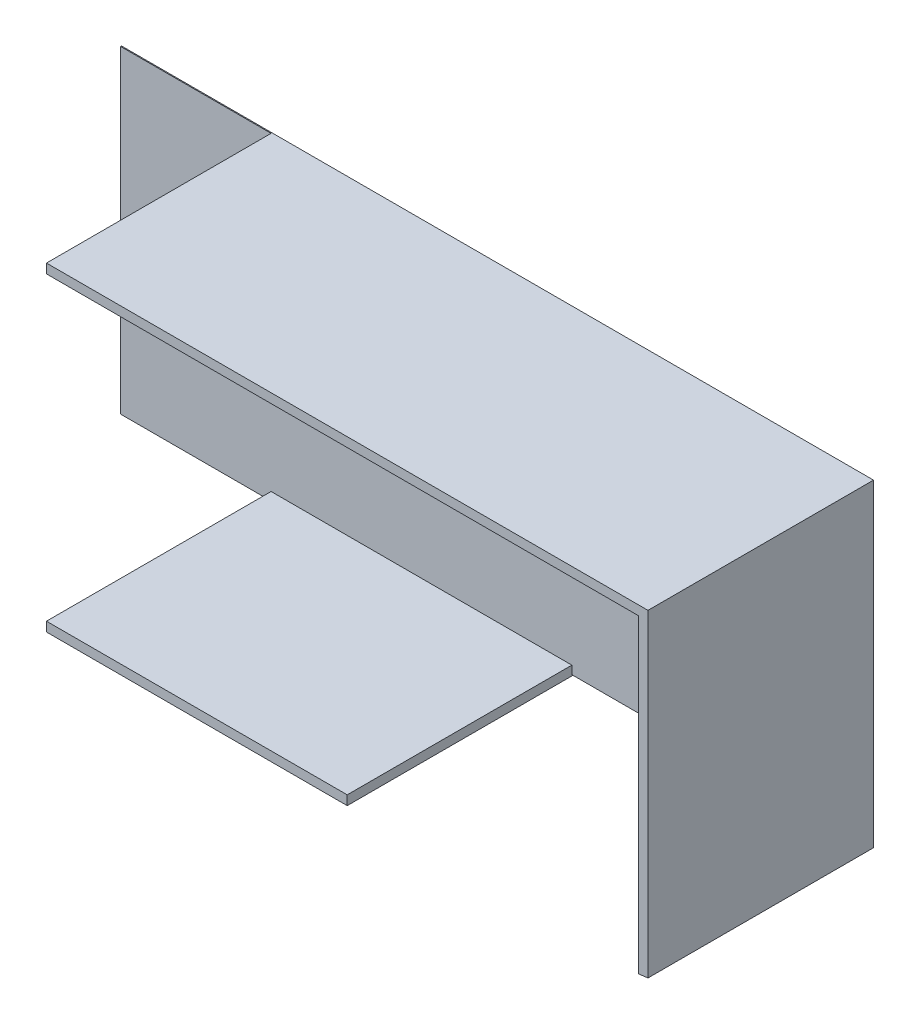
ISO-10303-21;
HEADER;
FILE_DESCRIPTION(('STEP AP214'),'2;1');
FILE_NAME('part.step','',(''),(''),'','','');
FILE_SCHEMA(('AUTOMOTIVE_DESIGN { 1 0 10303 214 1 1 1 1 }'));
ENDSEC;
DATA;
#1=APPLICATION_CONTEXT('core data for automotive mechanical design processes');
#2=APPLICATION_PROTOCOL_DEFINITION('international standard','automotive_design',2000,#1);
#3=PRODUCT_CONTEXT('',#1,'mechanical');
#4=PRODUCT('Part','Part','',(#3));
#5=PRODUCT_RELATED_PRODUCT_CATEGORY('part','',(#4));
#6=PRODUCT_DEFINITION_FORMATION('','',#4);
#7=PRODUCT_DEFINITION_CONTEXT('part definition',#1,'design');
#8=PRODUCT_DEFINITION('design','',#6,#7);
#9=PRODUCT_DEFINITION_SHAPE('','',#8);
#10=(LENGTH_UNIT() NAMED_UNIT(*) SI_UNIT(.MILLI.,.METRE.));
#11=(NAMED_UNIT(*) PLANE_ANGLE_UNIT() SI_UNIT($,.RADIAN.));
#12=(NAMED_UNIT(*) SI_UNIT($,.STERADIAN.) SOLID_ANGLE_UNIT());
#13=UNCERTAINTY_MEASURE_WITH_UNIT(LENGTH_MEASURE(1.E-05),#10,'distance_accuracy_value','');
#14=(GEOMETRIC_REPRESENTATION_CONTEXT(3) GLOBAL_UNCERTAINTY_ASSIGNED_CONTEXT((#13)) GLOBAL_UNIT_ASSIGNED_CONTEXT((#10,
#11,#12)) REPRESENTATION_CONTEXT('',''));
#15=CARTESIAN_POINT('',(0.,0.,0.));
#16=DIRECTION('',(0.,0.,1.));
#17=DIRECTION('',(1.,0.,0.));
#18=AXIS2_PLACEMENT_3D('',#15,#16,#17);
#19=CARTESIAN_POINT('',(406.4,-208.782857964852,0.635));
#20=DIRECTION('',(0.,-1.,0.));
#21=DIRECTION('',(0.,0.,-1.));
#22=AXIS2_PLACEMENT_3D('',#19,#20,#21);
#23=PLANE('',#22);
#24=DIRECTION('',(-1.,0.,0.));
#25=VECTOR('',#24,1.);
#26=CARTESIAN_POINT('',(406.4,-208.782857964852,0.635));
#27=LINE('',#26,#25);
#28=CARTESIAN_POINT('',(400.096509451272,-208.782857964852,0.634999999999997));
#29=VERTEX_POINT('',#28);
#30=CARTESIAN_POINT('',(203.2,-208.782857964852,0.635));
#31=VERTEX_POINT('',#30);
#32=EDGE_CURVE('E218',#29,#31,#27,.T.);
#33=ORIENTED_EDGE('',*,*,#32,.T.);
#34=DIRECTION('',(0.,0.,-1.));
#35=VECTOR('',#34,1.);
#36=CARTESIAN_POINT('',(203.2,-208.782857964852,0.635));
#37=LINE('',#36,#35);
#38=CARTESIAN_POINT('',(203.2,-208.782857964852,0.));
#39=VERTEX_POINT('',#38);
#40=EDGE_CURVE('E209',#31,#39,#37,.T.);
#41=ORIENTED_EDGE('',*,*,#40,.T.);
#42=DIRECTION('',(-1.,0.,0.));
#43=VECTOR('',#42,1.);
#44=CARTESIAN_POINT('',(406.4,-208.782857964852,0.));
#45=LINE('',#44,#43);
#46=CARTESIAN_POINT('',(400.096509451272,-208.782857964852,0.));
#47=VERTEX_POINT('',#46);
#48=EDGE_CURVE('E232',#47,#39,#45,.T.);
#49=ORIENTED_EDGE('',*,*,#48,.F.);
#50=DIRECTION('',(0.,0.,-1.));
#51=VECTOR('',#50,1.);
#52=CARTESIAN_POINT('',(400.096509451272,-208.782857964852,152.4));
#53=LINE('',#52,#51);
#54=EDGE_CURVE('E244',#29,#47,#53,.T.);
#55=ORIENTED_EDGE('',*,*,#54,.F.);
#56=EDGE_LOOP('',(#33,#41,#49,#55));
#57=FACE_BOUND('',#56,.T.);
#58=ADVANCED_FACE('F71',(#57),#23,.T.);
#59=CARTESIAN_POINT('',(0.,0.,0.635));
#60=DIRECTION('',(0.,0.,-1.));
#61=DIRECTION('',(-1.,0.,0.));
#62=AXIS2_PLACEMENT_3D('',#59,#60,#61);
#63=PLANE('',#62);
#64=DIRECTION('',(0.,1.,0.));
#65=VECTOR('',#64,1.);
#66=CARTESIAN_POINT('',(203.2,0.,0.635));
#67=LINE('',#66,#65);
#68=CARTESIAN_POINT('',(203.2,-203.2,0.635000000000052));
#69=VERTEX_POINT('',#68);
#70=EDGE_CURVE('E12',#31,#69,#67,.T.);
#71=ORIENTED_EDGE('',*,*,#70,.F.);
#72=ORIENTED_EDGE('',*,*,#32,.F.);
#73=DIRECTION('',(0.,1.,0.));
#74=VECTOR('',#73,1.);
#75=CARTESIAN_POINT('',(400.096509451272,0.,0.634999999999997));
#76=LINE('',#75,#74);
#77=CARTESIAN_POINT('',(400.096509451272,0.,0.635000000000052));
#78=VERTEX_POINT('',#77);
#79=EDGE_CURVE('E313',#29,#78,#76,.T.);
#80=ORIENTED_EDGE('',*,*,#79,.T.);
#81=DIRECTION('',(-1.,0.,0.));
#82=VECTOR('',#81,1.);
#83=CARTESIAN_POINT('',(0.,0.,0.634999999999997));
#84=LINE('',#83,#82);
#85=CARTESIAN_POINT('',(0.,0.,0.635000000000052));
#86=VERTEX_POINT('',#85);
#87=EDGE_CURVE('E251',#78,#86,#84,.T.);
#88=ORIENTED_EDGE('',*,*,#87,.T.);
#89=DIRECTION('',(0.,-1.,0.));
#90=VECTOR('',#89,1.);
#91=CARTESIAN_POINT('',(0.,0.,0.634999999999997));
#92=LINE('',#91,#90);
#93=CARTESIAN_POINT('',(0.,6.35,0.635000000000052));
#94=VERTEX_POINT('',#93);
#95=EDGE_CURVE('E255',#94,#86,#92,.T.);
#96=ORIENTED_EDGE('',*,*,#95,.F.);
#97=DIRECTION('',(1.,0.,0.));
#98=VECTOR('',#97,1.);
#99=CARTESIAN_POINT('',(-101.6,6.35,0.635));
#100=LINE('',#99,#98);
#101=CARTESIAN_POINT('',(-101.6,6.35,0.635));
#102=VERTEX_POINT('',#101);
#103=EDGE_CURVE('E227',#102,#94,#100,.T.);
#104=ORIENTED_EDGE('',*,*,#103,.F.);
#105=DIRECTION('',(0.,1.,0.));
#106=VECTOR('',#105,1.);
#107=CARTESIAN_POINT('',(-101.6,-208.782857964852,0.635));
#108=LINE('',#107,#106);
#109=CARTESIAN_POINT('',(-101.6,-208.782857964852,0.635));
#110=VERTEX_POINT('',#109);
#111=EDGE_CURVE('E222',#110,#102,#108,.T.);
#112=ORIENTED_EDGE('',*,*,#111,.F.);
#113=CARTESIAN_POINT('',(0.,-208.782857964852,0.635));
#114=VERTEX_POINT('',#113);
#115=EDGE_CURVE('E223',#114,#110,#27,.T.);
#116=ORIENTED_EDGE('',*,*,#115,.F.);
#117=DIRECTION('',(0.,1.,0.));
#118=VECTOR('',#117,1.);
#119=CARTESIAN_POINT('',(0.,0.,0.635));
#120=LINE('',#119,#118);
#121=CARTESIAN_POINT('',(0.,-203.2,0.635));
#122=VERTEX_POINT('',#121);
#123=EDGE_CURVE('E317',#114,#122,#120,.T.);
#124=ORIENTED_EDGE('',*,*,#123,.T.);
#125=DIRECTION('',(1.,0.,0.));
#126=VECTOR('',#125,1.);
#127=CARTESIAN_POINT('',(0.,-203.2,0.635));
#128=LINE('',#127,#126);
#129=EDGE_CURVE('E80',#122,#69,#128,.T.);
#130=ORIENTED_EDGE('',*,*,#129,.T.);
#131=EDGE_LOOP('',(#71,#72,#80,#88,#96,#104,#112,#116,#124,#130));
#132=FACE_BOUND('',#131,.T.);
#133=ADVANCED_FACE('F324',(#132),#63,.F.);
#134=CARTESIAN_POINT('',(0.,0.,152.4));
#135=DIRECTION('',(-1.,0.,0.));
#136=DIRECTION('',(0.,0.,1.));
#137=AXIS2_PLACEMENT_3D('',#134,#135,#136);
#138=PLANE('',#137);
#139=DIRECTION('',(0.,0.,-1.));
#140=VECTOR('',#139,1.);
#141=CARTESIAN_POINT('',(0.,6.35,152.4));
#142=LINE('',#141,#140);
#143=CARTESIAN_POINT('',(0.,6.35,152.4));
#144=VERTEX_POINT('',#143);
#145=EDGE_CURVE('E95',#144,#94,#142,.T.);
#146=ORIENTED_EDGE('',*,*,#145,.T.);
#147=ORIENTED_EDGE('',*,*,#95,.T.);
#148=DIRECTION('',(0.,0.,-1.));
#149=VECTOR('',#148,1.);
#150=CARTESIAN_POINT('',(0.,0.,152.4));
#151=LINE('',#150,#149);
#152=CARTESIAN_POINT('',(0.,0.,152.4));
#153=VERTEX_POINT('',#152);
#154=EDGE_CURVE('E301',#153,#86,#151,.T.);
#155=ORIENTED_EDGE('',*,*,#154,.F.);
#156=DIRECTION('',(0.,1.,0.));
#157=VECTOR('',#156,1.);
#158=CARTESIAN_POINT('',(0.,0.,152.4));
#159=LINE('',#158,#157);
#160=EDGE_CURVE('E271',#153,#144,#159,.T.);
#161=ORIENTED_EDGE('',*,*,#160,.T.);
#162=EDGE_LOOP('',(#146,#147,#155,#161));
#163=FACE_BOUND('',#162,.T.);
#164=ADVANCED_FACE('F382',(#163),#138,.T.);
#165=CARTESIAN_POINT('',(0.,0.,152.4));
#166=DIRECTION('',(0.,1.,0.));
#167=DIRECTION('',(0.,0.,1.));
#168=AXIS2_PLACEMENT_3D('',#165,#166,#167);
#169=PLANE('',#168);
#170=ORIENTED_EDGE('',*,*,#87,.F.);
#171=DIRECTION('',(0.,0.,-1.));
#172=VECTOR('',#171,1.);
#173=CARTESIAN_POINT('',(400.096509451272,0.,152.4));
#174=LINE('',#173,#172);
#175=CARTESIAN_POINT('',(400.096509451272,0.,152.4));
#176=VERTEX_POINT('',#175);
#177=EDGE_CURVE('E297',#176,#78,#174,.T.);
#178=ORIENTED_EDGE('',*,*,#177,.F.);
#179=DIRECTION('',(1.,0.,0.));
#180=VECTOR('',#179,1.);
#181=CARTESIAN_POINT('',(0.,0.,152.4));
#182=LINE('',#181,#180);
#183=EDGE_CURVE('E274',#153,#176,#182,.T.);
#184=ORIENTED_EDGE('',*,*,#183,.F.);
#185=ORIENTED_EDGE('',*,*,#154,.T.);
#186=EDGE_LOOP('',(#170,#178,#184,#185));
#187=FACE_BOUND('',#186,.T.);
#188=ADVANCED_FACE('F380',(#187),#169,.F.);
#189=CARTESIAN_POINT('',(30.9696755894847,-254.473159377706,152.4));
#190=DIRECTION('',(-0.120809769314614,0.992675676965115,0.));
#191=DIRECTION('',(-0.992675676965115,-0.120809769314614,0.));
#192=AXIS2_PLACEMENT_3D('',#189,#190,#191);
#193=PLANE('',#192);
#194=DIRECTION('',(0.992675676965115,0.120809769314614,0.));
#195=VECTOR('',#194,1.);
#196=CARTESIAN_POINT('',(30.9696755894847,-254.473159377706,0.));
#197=LINE('',#196,#195);
#198=CARTESIAN_POINT('',(400.096509451272,-209.55,0.));
#199=VERTEX_POINT('',#198);
#200=CARTESIAN_POINT('',(406.4,-208.782857964852,0.));
#201=VERTEX_POINT('',#200);
#202=EDGE_CURVE('E258',#199,#201,#197,.T.);
#203=ORIENTED_EDGE('',*,*,#202,.T.);
#204=DIRECTION('',(0.,0.,-1.));
#205=VECTOR('',#204,1.);
#206=CARTESIAN_POINT('',(406.4,-208.782857964852,152.4));
#207=LINE('',#206,#205);
#208=CARTESIAN_POINT('',(406.4,-208.782857964852,152.4));
#209=VERTEX_POINT('',#208);
#210=EDGE_CURVE('E310',#209,#201,#207,.T.);
#211=ORIENTED_EDGE('',*,*,#210,.F.);
#212=DIRECTION('',(0.992675676965115,0.120809769314614,0.));
#213=VECTOR('',#212,1.);
#214=CARTESIAN_POINT('',(30.9696755894847,-254.473159377706,152.4));
#215=LINE('',#214,#213);
#216=CARTESIAN_POINT('',(400.096509451272,-209.55,152.4));
#217=VERTEX_POINT('',#216);
#218=EDGE_CURVE('E259',#217,#209,#215,.T.);
#219=ORIENTED_EDGE('',*,*,#218,.F.);
#220=DIRECTION('',(0.,0.,-1.));
#221=VECTOR('',#220,1.);
#222=CARTESIAN_POINT('',(400.096509451272,-209.55,152.4));
#223=LINE('',#222,#221);
#224=EDGE_CURVE('E280',#217,#199,#223,.T.);
#225=ORIENTED_EDGE('',*,*,#224,.T.);
#226=EDGE_LOOP('',(#203,#211,#219,#225));
#227=FACE_BOUND('',#226,.T.);
#228=ADVANCED_FACE('F73',(#227),#193,.F.);
#229=CARTESIAN_POINT('',(406.4,0.,152.4));
#230=DIRECTION('',(-1.,0.,0.));
#231=DIRECTION('',(0.,0.,1.));
#232=AXIS2_PLACEMENT_3D('',#229,#230,#231);
#233=PLANE('',#232);
#234=DIRECTION('',(0.,1.,0.));
#235=VECTOR('',#234,1.);
#236=CARTESIAN_POINT('',(406.4,0.,0.));
#237=LINE('',#236,#235);
#238=CARTESIAN_POINT('',(406.4,6.35,0.));
#239=VERTEX_POINT('',#238);
#240=EDGE_CURVE('E284',#201,#239,#237,.T.);
#241=ORIENTED_EDGE('',*,*,#240,.T.);
#242=DIRECTION('',(0.,0.,-1.));
#243=VECTOR('',#242,1.);
#244=CARTESIAN_POINT('',(406.4,6.35,152.4));
#245=LINE('',#244,#243);
#246=CARTESIAN_POINT('',(406.4,6.35,152.4));
#247=VERTEX_POINT('',#246);
#248=EDGE_CURVE('E307',#247,#239,#245,.T.);
#249=ORIENTED_EDGE('',*,*,#248,.F.);
#250=DIRECTION('',(0.,1.,0.));
#251=VECTOR('',#250,1.);
#252=CARTESIAN_POINT('',(406.4,0.,152.4));
#253=LINE('',#252,#251);
#254=EDGE_CURVE('E263',#209,#247,#253,.T.);
#255=ORIENTED_EDGE('',*,*,#254,.F.);
#256=ORIENTED_EDGE('',*,*,#210,.T.);
#257=EDGE_LOOP('',(#241,#249,#255,#256));
#258=FACE_BOUND('',#257,.T.);
#259=ADVANCED_FACE('F386',(#258),#233,.F.);
#260=CARTESIAN_POINT('',(0.,6.35,152.4));
#261=DIRECTION('',(0.,1.,0.));
#262=DIRECTION('',(0.,0.,1.));
#263=AXIS2_PLACEMENT_3D('',#260,#261,#262);
#264=PLANE('',#263);
#265=ORIENTED_EDGE('',*,*,#103,.T.);
#266=ORIENTED_EDGE('',*,*,#145,.F.);
#267=DIRECTION('',(1.,0.,0.));
#268=VECTOR('',#267,1.);
#269=CARTESIAN_POINT('',(0.,6.35,152.4));
#270=LINE('',#269,#268);
#271=EDGE_CURVE('E267',#144,#247,#270,.T.);
#272=ORIENTED_EDGE('',*,*,#271,.T.);
#273=ORIENTED_EDGE('',*,*,#248,.T.);
#274=DIRECTION('',(1.,0.,0.));
#275=VECTOR('',#274,1.);
#276=CARTESIAN_POINT('',(0.,6.35,0.));
#277=LINE('',#276,#275);
#278=CARTESIAN_POINT('',(-101.6,6.35,0.));
#279=VERTEX_POINT('',#278);
#280=EDGE_CURVE('E288',#279,#239,#277,.T.);
#281=ORIENTED_EDGE('',*,*,#280,.F.);
#282=DIRECTION('',(0.,0.,-1.));
#283=VECTOR('',#282,1.);
#284=CARTESIAN_POINT('',(-101.6,6.35,0.635));
#285=LINE('',#284,#283);
#286=EDGE_CURVE('E240',#102,#279,#285,.T.);
#287=ORIENTED_EDGE('',*,*,#286,.F.);
#288=EDGE_LOOP('',(#265,#266,#272,#273,#281,#287));
#289=FACE_BOUND('',#288,.T.);
#290=ADVANCED_FACE('F362',(#289),#264,.T.);
#291=CARTESIAN_POINT('',(400.096509451272,0.,152.4));
#292=DIRECTION('',(1.,0.,0.));
#293=DIRECTION('',(0.,0.,-1.));
#294=AXIS2_PLACEMENT_3D('',#291,#292,#293);
#295=PLANE('',#294);
#296=ORIENTED_EDGE('',*,*,#79,.F.);
#297=ORIENTED_EDGE('',*,*,#54,.T.);
#298=DIRECTION('',(0.,-1.,0.));
#299=VECTOR('',#298,1.);
#300=CARTESIAN_POINT('',(400.096509451272,0.,0.));
#301=LINE('',#300,#299);
#302=EDGE_CURVE('E264',#47,#199,#301,.T.);
#303=ORIENTED_EDGE('',*,*,#302,.T.);
#304=ORIENTED_EDGE('',*,*,#224,.F.);
#305=DIRECTION('',(0.,-1.,0.));
#306=VECTOR('',#305,1.);
#307=CARTESIAN_POINT('',(400.096509451272,0.,152.4));
#308=LINE('',#307,#306);
#309=EDGE_CURVE('E277',#176,#217,#308,.T.);
#310=ORIENTED_EDGE('',*,*,#309,.F.);
#311=ORIENTED_EDGE('',*,*,#177,.T.);
#312=EDGE_LOOP('',(#296,#297,#303,#304,#310,#311));
#313=FACE_BOUND('',#312,.T.);
#314=ADVANCED_FACE('F373',(#313),#295,.F.);
#315=CARTESIAN_POINT('',(0.,0.,152.4));
#316=DIRECTION('',(0.,0.,1.));
#317=DIRECTION('',(1.,0.,0.));
#318=AXIS2_PLACEMENT_3D('',#315,#316,#317);
#319=PLANE('',#318);
#320=ORIENTED_EDGE('',*,*,#218,.T.);
#321=ORIENTED_EDGE('',*,*,#254,.T.);
#322=ORIENTED_EDGE('',*,*,#271,.F.);
#323=ORIENTED_EDGE('',*,*,#160,.F.);
#324=ORIENTED_EDGE('',*,*,#183,.T.);
#325=ORIENTED_EDGE('',*,*,#309,.T.);
#326=EDGE_LOOP('',(#320,#321,#322,#323,#324,#325));
#327=FACE_BOUND('',#326,.T.);
#328=ADVANCED_FACE('F385',(#327),#319,.T.);
#329=CARTESIAN_POINT('',(0.,0.,0.));
#330=DIRECTION('',(0.,0.,1.));
#331=DIRECTION('',(1.,0.,0.));
#332=AXIS2_PLACEMENT_3D('',#329,#330,#331);
#333=PLANE('',#332);
#334=ORIENTED_EDGE('',*,*,#48,.T.);
#335=DIRECTION('',(0.,1.,0.));
#336=VECTOR('',#335,1.);
#337=CARTESIAN_POINT('',(203.2,0.,0.));
#338=LINE('',#337,#336);
#339=CARTESIAN_POINT('',(203.2,-209.55,0.));
#340=VERTEX_POINT('',#339);
#341=EDGE_CURVE('E337',#340,#39,#338,.T.);
#342=ORIENTED_EDGE('',*,*,#341,.F.);
#343=DIRECTION('',(1.,0.,0.));
#344=VECTOR('',#343,1.);
#345=CARTESIAN_POINT('',(0.,-209.55,0.));
#346=LINE('',#345,#344);
#347=CARTESIAN_POINT('',(0.,-209.55,0.));
#348=VERTEX_POINT('',#347);
#349=EDGE_CURVE('E203',#348,#340,#346,.T.);
#350=ORIENTED_EDGE('',*,*,#349,.F.);
#351=DIRECTION('',(0.,1.,0.));
#352=VECTOR('',#351,1.);
#353=CARTESIAN_POINT('',(0.,0.,0.));
#354=LINE('',#353,#352);
#355=CARTESIAN_POINT('',(0.,-208.782857964852,0.));
#356=VERTEX_POINT('',#355);
#357=EDGE_CURVE('E199',#348,#356,#354,.T.);
#358=ORIENTED_EDGE('',*,*,#357,.T.);
#359=CARTESIAN_POINT('',(-101.6,-208.782857964852,0.));
#360=VERTEX_POINT('',#359);
#361=EDGE_CURVE('E217',#356,#360,#45,.T.);
#362=ORIENTED_EDGE('',*,*,#361,.T.);
#363=DIRECTION('',(0.,1.,0.));
#364=VECTOR('',#363,1.);
#365=CARTESIAN_POINT('',(-101.6,-208.782857964852,0.));
#366=LINE('',#365,#364);
#367=EDGE_CURVE('E236',#360,#279,#366,.T.);
#368=ORIENTED_EDGE('',*,*,#367,.T.);
#369=ORIENTED_EDGE('',*,*,#280,.T.);
#370=ORIENTED_EDGE('',*,*,#240,.F.);
#371=ORIENTED_EDGE('',*,*,#202,.F.);
#372=ORIENTED_EDGE('',*,*,#302,.F.);
#373=EDGE_LOOP('',(#334,#342,#350,#358,#362,#368,#369,#370,#371,#372));
#374=FACE_BOUND('',#373,.T.);
#375=ADVANCED_FACE('F347',(#374),#333,.F.);
#376=DIRECTION('',(0.,0.,-1.));
#377=VECTOR('',#376,1.);
#378=CARTESIAN_POINT('',(0.,-208.782857964852,0.635));
#379=LINE('',#378,#377);
#380=EDGE_CURVE('E205',#114,#356,#379,.T.);
#381=ORIENTED_EDGE('',*,*,#380,.F.);
#382=ORIENTED_EDGE('',*,*,#115,.T.);
#383=DIRECTION('',(0.,0.,-1.));
#384=VECTOR('',#383,1.);
#385=CARTESIAN_POINT('',(-101.6,-208.782857964852,0.635));
#386=LINE('',#385,#384);
#387=EDGE_CURVE('E231',#110,#360,#386,.T.);
#388=ORIENTED_EDGE('',*,*,#387,.T.);
#389=ORIENTED_EDGE('',*,*,#361,.F.);
#390=EDGE_LOOP('',(#381,#382,#388,#389));
#391=FACE_BOUND('',#390,.T.);
#392=ADVANCED_FACE('F352',(#391),#23,.T.);
#393=CARTESIAN_POINT('',(-101.6,-208.782857964852,0.635));
#394=DIRECTION('',(-1.,0.,0.));
#395=DIRECTION('',(0.,0.,1.));
#396=AXIS2_PLACEMENT_3D('',#393,#394,#395);
#397=PLANE('',#396);
#398=ORIENTED_EDGE('',*,*,#367,.F.);
#399=ORIENTED_EDGE('',*,*,#387,.F.);
#400=ORIENTED_EDGE('',*,*,#111,.T.);
#401=ORIENTED_EDGE('',*,*,#286,.T.);
#402=EDGE_LOOP('',(#398,#399,#400,#401));
#403=FACE_BOUND('',#402,.T.);
#404=ADVANCED_FACE('F360',(#403),#397,.T.);
#405=CARTESIAN_POINT('',(0.,-203.2,152.4));
#406=DIRECTION('',(0.,1.,0.));
#407=DIRECTION('',(0.,0.,1.));
#408=AXIS2_PLACEMENT_3D('',#405,#406,#407);
#409=PLANE('',#408);
#410=ORIENTED_EDGE('',*,*,#129,.F.);
#411=DIRECTION('',(0.,0.,-1.));
#412=VECTOR('',#411,1.);
#413=CARTESIAN_POINT('',(0.,-203.2,152.4));
#414=LINE('',#413,#412);
#415=CARTESIAN_POINT('',(0.,-203.2,152.4));
#416=VERTEX_POINT('',#415);
#417=EDGE_CURVE('E87',#416,#122,#414,.T.);
#418=ORIENTED_EDGE('',*,*,#417,.F.);
#419=DIRECTION('',(1.,0.,0.));
#420=VECTOR('',#419,1.);
#421=CARTESIAN_POINT('',(0.,-203.2,152.4));
#422=LINE('',#421,#420);
#423=CARTESIAN_POINT('',(203.2,-203.2,152.4));
#424=VERTEX_POINT('',#423);
#425=EDGE_CURVE('E190',#416,#424,#422,.T.);
#426=ORIENTED_EDGE('',*,*,#425,.T.);
#427=DIRECTION('',(0.,0.,-1.));
#428=VECTOR('',#427,1.);
#429=CARTESIAN_POINT('',(203.2,-203.2,152.4));
#430=LINE('',#429,#428);
#431=EDGE_CURVE('E185',#424,#69,#430,.T.);
#432=ORIENTED_EDGE('',*,*,#431,.T.);
#433=EDGE_LOOP('',(#410,#418,#426,#432));
#434=FACE_BOUND('',#433,.T.);
#435=ADVANCED_FACE('F328',(#434),#409,.T.);
#436=CARTESIAN_POINT('',(0.,-209.55,152.4));
#437=DIRECTION('',(0.,1.,0.));
#438=DIRECTION('',(-1.,0.,0.));
#439=AXIS2_PLACEMENT_3D('',#436,#437,#438);
#440=PLANE('',#439);
#441=ORIENTED_EDGE('',*,*,#349,.T.);
#442=DIRECTION('',(0.,0.,-1.));
#443=VECTOR('',#442,1.);
#444=CARTESIAN_POINT('',(203.2,-209.55,152.4));
#445=LINE('',#444,#443);
#446=CARTESIAN_POINT('',(203.2,-209.55,152.4));
#447=VERTEX_POINT('',#446);
#448=EDGE_CURVE('E182',#447,#340,#445,.T.);
#449=ORIENTED_EDGE('',*,*,#448,.F.);
#450=DIRECTION('',(1.,0.,0.));
#451=VECTOR('',#450,1.);
#452=CARTESIAN_POINT('',(0.,-209.55,152.4));
#453=LINE('',#452,#451);
#454=CARTESIAN_POINT('',(0.,-209.55,152.4));
#455=VERTEX_POINT('',#454);
#456=EDGE_CURVE('E191',#455,#447,#453,.T.);
#457=ORIENTED_EDGE('',*,*,#456,.F.);
#458=DIRECTION('',(0.,0.,-1.));
#459=VECTOR('',#458,1.);
#460=CARTESIAN_POINT('',(0.,-209.55,152.4));
#461=LINE('',#460,#459);
#462=EDGE_CURVE('E332',#455,#348,#461,.T.);
#463=ORIENTED_EDGE('',*,*,#462,.T.);
#464=EDGE_LOOP('',(#441,#449,#457,#463));
#465=FACE_BOUND('',#464,.T.);
#466=ADVANCED_FACE('F201',(#465),#440,.F.);
#467=CARTESIAN_POINT('',(203.2,0.,152.4));
#468=DIRECTION('',(-1.,0.,0.));
#469=DIRECTION('',(0.,0.,1.));
#470=AXIS2_PLACEMENT_3D('',#467,#468,#469);
#471=PLANE('',#470);
#472=ORIENTED_EDGE('',*,*,#40,.F.);
#473=ORIENTED_EDGE('',*,*,#70,.T.);
#474=ORIENTED_EDGE('',*,*,#431,.F.);
#475=DIRECTION('',(0.,1.,0.));
#476=VECTOR('',#475,1.);
#477=CARTESIAN_POINT('',(203.2,0.,152.4));
#478=LINE('',#477,#476);
#479=EDGE_CURVE('E178',#447,#424,#478,.T.);
#480=ORIENTED_EDGE('',*,*,#479,.F.);
#481=ORIENTED_EDGE('',*,*,#448,.T.);
#482=ORIENTED_EDGE('',*,*,#341,.T.);
#483=EDGE_LOOP('',(#472,#473,#474,#480,#481,#482));
#484=FACE_BOUND('',#483,.T.);
#485=ADVANCED_FACE('F180',(#484),#471,.F.);
#486=CARTESIAN_POINT('',(0.,0.,152.4));
#487=DIRECTION('',(-1.,0.,0.));
#488=DIRECTION('',(0.,0.,1.));
#489=AXIS2_PLACEMENT_3D('',#486,#487,#488);
#490=PLANE('',#489);
#491=ORIENTED_EDGE('',*,*,#123,.F.);
#492=ORIENTED_EDGE('',*,*,#380,.T.);
#493=ORIENTED_EDGE('',*,*,#357,.F.);
#494=ORIENTED_EDGE('',*,*,#462,.F.);
#495=DIRECTION('',(0.,1.,0.));
#496=VECTOR('',#495,1.);
#497=CARTESIAN_POINT('',(0.,0.,152.4));
#498=LINE('',#497,#496);
#499=EDGE_CURVE('E196',#455,#416,#498,.T.);
#500=ORIENTED_EDGE('',*,*,#499,.T.);
#501=ORIENTED_EDGE('',*,*,#417,.T.);
#502=EDGE_LOOP('',(#491,#492,#493,#494,#500,#501));
#503=FACE_BOUND('',#502,.T.);
#504=ADVANCED_FACE('F349',(#503),#490,.T.);
#505=CARTESIAN_POINT('',(0.,0.,152.4));
#506=DIRECTION('',(0.,0.,1.));
#507=DIRECTION('',(1.,0.,0.));
#508=AXIS2_PLACEMENT_3D('',#505,#506,#507);
#509=PLANE('',#508);
#510=ORIENTED_EDGE('',*,*,#456,.T.);
#511=ORIENTED_EDGE('',*,*,#479,.T.);
#512=ORIENTED_EDGE('',*,*,#425,.F.);
#513=ORIENTED_EDGE('',*,*,#499,.F.);
#514=EDGE_LOOP('',(#510,#511,#512,#513));
#515=FACE_BOUND('',#514,.T.);
#516=ADVANCED_FACE('F195',(#515),#509,.T.);
#517=CLOSED_SHELL('',(#58,#133,#164,#188,#228,#259,#290,#314,#328,#375,#392,#404,#435,#466,#485,
#504,#516));
#518=MANIFOLD_SOLID_BREP('B2',#517);
#519=ADVANCED_BREP_SHAPE_REPRESENTATION('',(#18,#518),#14);
#520=SHAPE_DEFINITION_REPRESENTATION(#9,#519);
ENDSEC;
END-ISO-10303-21;
